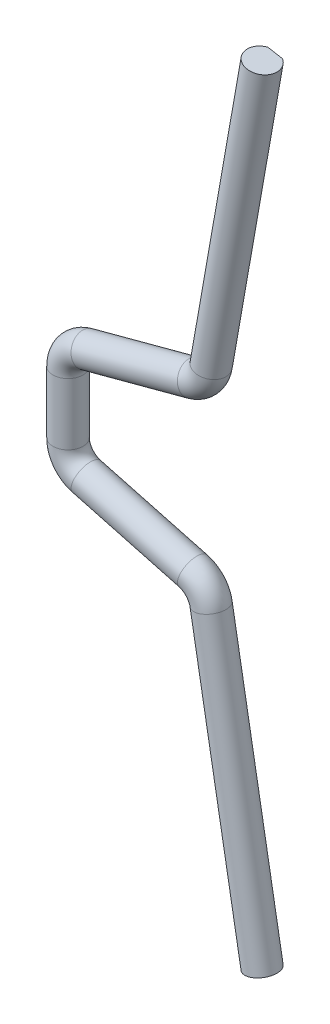
ISO-10303-21;
HEADER;
FILE_DESCRIPTION(('STEP AP214'),'2;1');
FILE_NAME('part.step','',(''),(''),'','','');
FILE_SCHEMA(('AUTOMOTIVE_DESIGN { 1 0 10303 214 1 1 1 1 }'));
ENDSEC;
DATA;
#1=APPLICATION_CONTEXT('core data for automotive mechanical design processes');
#2=APPLICATION_PROTOCOL_DEFINITION('international standard','automotive_design',2000,#1);
#3=PRODUCT_CONTEXT('',#1,'mechanical');
#4=PRODUCT('Part','Part','',(#3));
#5=PRODUCT_RELATED_PRODUCT_CATEGORY('part','',(#4));
#6=PRODUCT_DEFINITION_FORMATION('','',#4);
#7=PRODUCT_DEFINITION_CONTEXT('part definition',#1,'design');
#8=PRODUCT_DEFINITION('design','',#6,#7);
#9=PRODUCT_DEFINITION_SHAPE('','',#8);
#10=(LENGTH_UNIT() NAMED_UNIT(*) SI_UNIT(.MILLI.,.METRE.));
#11=(NAMED_UNIT(*) PLANE_ANGLE_UNIT() SI_UNIT($,.RADIAN.));
#12=(NAMED_UNIT(*) SI_UNIT($,.STERADIAN.) SOLID_ANGLE_UNIT());
#13=UNCERTAINTY_MEASURE_WITH_UNIT(LENGTH_MEASURE(1.E-05),#10,'distance_accuracy_value','');
#14=(GEOMETRIC_REPRESENTATION_CONTEXT(3) GLOBAL_UNCERTAINTY_ASSIGNED_CONTEXT((#13)) GLOBAL_UNIT_ASSIGNED_CONTEXT((#10,
#11,#12)) REPRESENTATION_CONTEXT('',''));
#15=CARTESIAN_POINT('',(0.,0.,0.));
#16=DIRECTION('',(0.,0.,1.));
#17=DIRECTION('',(1.,0.,0.));
#18=AXIS2_PLACEMENT_3D('',#15,#16,#17);
#19=CARTESIAN_POINT('',(0.,1.54084126502629,0.));
#20=DIRECTION('',(0.,-1.,0.));
#21=DIRECTION('',(1.,0.,0.));
#22=AXIS2_PLACEMENT_3D('',#19,#20,#21);
#23=CYLINDRICAL_SURFACE('',#22,0.75);
#24=CARTESIAN_POINT('',(0.,1.5408412650263,0.));
#25=DIRECTION('',(0.,1.,0.));
#26=DIRECTION('',(0.,0.,1.));
#27=AXIS2_PLACEMENT_3D('',#24,#25,#26);
#28=CIRCLE('',#27,0.75);
#29=CARTESIAN_POINT('',(-0.65,1.5408412650263,0.374165738677395));
#30=VERTEX_POINT('',#29);
#31=CARTESIAN_POINT('',(0.374165738677394,1.5408412650263,-0.65));
#32=VERTEX_POINT('',#31);
#33=EDGE_CURVE('E137',#30,#32,#28,.T.);
#34=ORIENTED_EDGE('',*,*,#33,.F.);
#35=DIRECTION('',(0.,-1.,0.));
#36=VECTOR('',#35,1.);
#37=CARTESIAN_POINT('',(-0.65,1.54084126502629,0.374165738677395));
#38=LINE('',#37,#36);
#39=CARTESIAN_POINT('',(-0.65,-1.54084126502631,0.374165738677396));
#40=VERTEX_POINT('',#39);
#41=EDGE_CURVE('E126',#30,#40,#38,.T.);
#42=ORIENTED_EDGE('',*,*,#41,.T.);
#43=CARTESIAN_POINT('',(0.,-1.54084126502629,0.));
#44=DIRECTION('',(0.,1.,0.));
#45=DIRECTION('',(0.,0.,1.));
#46=AXIS2_PLACEMENT_3D('',#43,#44,#45);
#47=CIRCLE('',#46,0.75);
#48=CARTESIAN_POINT('',(0.374165738677394,-1.54084126502629,-0.65));
#49=VERTEX_POINT('',#48);
#50=EDGE_CURVE('E135',#40,#49,#47,.T.);
#51=ORIENTED_EDGE('',*,*,#50,.T.);
#52=DIRECTION('',(0.,-1.,0.));
#53=VECTOR('',#52,1.);
#54=CARTESIAN_POINT('',(0.374165738677394,1.54084126502629,-0.65));
#55=LINE('',#54,#53);
#56=EDGE_CURVE('E224',#49,#32,#55,.F.);
#57=ORIENTED_EDGE('',*,*,#56,.T.);
#58=EDGE_LOOP('',(#34,#42,#51,#57));
#59=FACE_BOUND('',#58,.T.);
#60=ADVANCED_FACE('F34',(#59),#23,.T.);
#61=CARTESIAN_POINT('',(9.68358303061866,19.595,0.));
#62=DIRECTION('',(0.173648177666931,0.984807753012208,0.));
#63=DIRECTION('',(0.,0.,1.));
#64=AXIS2_PLACEMENT_3D('',#61,#62,#63);
#65=PLANE('',#64);
#66=DIRECTION('',(0.984807753012208,-0.173648177666931,0.));
#67=VECTOR('',#66,1.);
#68=CARTESIAN_POINT('',(9.68358303061866,19.595,-0.65));
#69=LINE('',#68,#67);
#70=CARTESIAN_POINT('',(9.31510171025762,19.6599731986667,-0.65));
#71=VERTEX_POINT('',#70);
#72=CARTESIAN_POINT('',(10.0520643509797,19.5300268013333,-0.65));
#73=VERTEX_POINT('',#72);
#74=EDGE_CURVE('E173',#71,#73,#69,.T.);
#75=ORIENTED_EDGE('',*,*,#74,.F.);
#76=CARTESIAN_POINT('',(9.68358303061866,19.595,0.));
#77=DIRECTION('',(0.173648177666931,0.984807753012208,0.));
#78=DIRECTION('',(0.,0.,1.));
#79=AXIS2_PLACEMENT_3D('',#76,#77,#78);
#80=CIRCLE('',#79,0.75);
#81=EDGE_CURVE('E205',#71,#73,#80,.T.);
#82=ORIENTED_EDGE('',*,*,#81,.T.);
#83=EDGE_LOOP('',(#75,#82));
#84=FACE_BOUND('',#83,.T.);
#85=ADVANCED_FACE('F36',(#84),#65,.T.);
#86=CARTESIAN_POINT('',(9.68358303061866,-19.595,0.));
#87=DIRECTION('',(-0.173648177666931,0.984807753012208,0.));
#88=DIRECTION('',(0.,0.,1.));
#89=AXIS2_PLACEMENT_3D('',#86,#87,#88);
#90=PLANE('',#89);
#91=CARTESIAN_POINT('',(9.68358303061866,-19.595,0.));
#92=DIRECTION('',(-0.173648177666931,0.984807753012208,0.));
#93=DIRECTION('',(0.,0.,1.));
#94=AXIS2_PLACEMENT_3D('',#91,#92,#93);
#95=CIRCLE('',#94,0.75);
#96=CARTESIAN_POINT('',(9.31510171025762,-19.6599731986667,-0.65));
#97=VERTEX_POINT('',#96);
#98=CARTESIAN_POINT('',(10.0520643509797,-19.5300268013333,-0.65));
#99=VERTEX_POINT('',#98);
#100=EDGE_CURVE('E159',#97,#99,#95,.T.);
#101=ORIENTED_EDGE('',*,*,#100,.F.);
#102=DIRECTION('',(0.984807753012208,0.173648177666931,0.));
#103=VECTOR('',#102,1.);
#104=CARTESIAN_POINT('',(9.68358303061866,-19.595,-0.65));
#105=LINE('',#104,#103);
#106=EDGE_CURVE('E172',#97,#99,#105,.T.);
#107=ORIENTED_EDGE('',*,*,#106,.T.);
#108=EDGE_LOOP('',(#101,#107));
#109=FACE_BOUND('',#108,.T.);
#110=ADVANCED_FACE('F171',(#109),#90,.F.);
#111=CARTESIAN_POINT('',(9.68358303061866,19.595,0.));
#112=DIRECTION('',(-0.173648177666931,-0.984807753012208,0.));
#113=DIRECTION('',(0.984807753012208,-0.173648177666931,0.));
#114=AXIS2_PLACEMENT_3D('',#111,#112,#113);
#115=CYLINDRICAL_SURFACE('',#114,0.75);
#116=ORIENTED_EDGE('',*,*,#81,.F.);
#117=DIRECTION('',(-0.173648177666931,-0.984807753012208,0.));
#118=VECTOR('',#117,1.);
#119=CARTESIAN_POINT('',(9.31510171025762,19.6599731986667,-0.65));
#120=LINE('',#119,#118);
#121=CARTESIAN_POINT('',(6.76980129193274,5.22485721075549,-0.65));
#122=VERTEX_POINT('',#121);
#123=EDGE_CURVE('E202',#71,#122,#120,.T.);
#124=ORIENTED_EDGE('',*,*,#123,.T.);
#125=CARTESIAN_POINT('',(7.13828261229377,5.15988401208876,0.));
#126=DIRECTION('',(0.173648177666931,0.984807753012208,0.));
#127=DIRECTION('',(0.,0.,1.));
#128=AXIS2_PLACEMENT_3D('',#125,#126,#127);
#129=CIRCLE('',#128,0.75);
#130=CARTESIAN_POINT('',(7.50676393265481,5.09491081342203,-0.65));
#131=VERTEX_POINT('',#130);
#132=EDGE_CURVE('E208',#122,#131,#129,.T.);
#133=ORIENTED_EDGE('',*,*,#132,.T.);
#134=DIRECTION('',(-0.173648177666931,-0.984807753012208,0.));
#135=VECTOR('',#134,1.);
#136=CARTESIAN_POINT('',(10.0520643509797,19.5300268013333,-0.65));
#137=LINE('',#136,#135);
#138=EDGE_CURVE('E174',#131,#73,#137,.F.);
#139=ORIENTED_EDGE('',*,*,#138,.T.);
#140=EDGE_LOOP('',(#116,#124,#133,#139));
#141=FACE_BOUND('',#140,.T.);
#142=ADVANCED_FACE('F239',(#141),#115,.T.);
#143=CARTESIAN_POINT('',(5.90727292102851,5.37694423417241,0.));
#144=DIRECTION('',(0.,0.,-1.));
#145=DIRECTION('',(-1.,0.,0.));
#146=AXIS2_PLACEMENT_3D('',#143,#144,#145);
#147=TOROIDAL_SURFACE('',#146,1.25,0.75);
#148=CARTESIAN_POINT('',(6.23079672740665,4.16953695131108,0.));
#149=DIRECTION('',(0.96592582628907,0.258819045102514,0.));
#150=DIRECTION('',(0.,0.,1.));
#151=AXIS2_PLACEMENT_3D('',#148,#149,#150);
#152=CIRCLE('',#151,0.75);
#153=CARTESIAN_POINT('',(6.13395550821209,4.5309533016121,-0.65));
#154=VERTEX_POINT('',#153);
#155=CARTESIAN_POINT('',(6.32763794660121,3.80812060101005,-0.65));
#156=VERTEX_POINT('',#155);
#157=EDGE_CURVE('E211',#154,#156,#152,.T.);
#158=ORIENTED_EDGE('',*,*,#157,.T.);
#159=CARTESIAN_POINT('',(5.90727292102851,5.37694423417241,-0.65));
#160=DIRECTION('',(0.,0.,1.));
#161=DIRECTION('',(1.,0.,0.));
#162=AXIS2_PLACEMENT_3D('',#159,#160,#161);
#163=CIRCLE('',#162,1.62416573867739);
#164=EDGE_CURVE('E179',#156,#131,#163,.T.);
#165=ORIENTED_EDGE('',*,*,#164,.T.);
#166=ORIENTED_EDGE('',*,*,#132,.F.);
#167=CARTESIAN_POINT('',(5.90727292102851,5.37694423417241,-0.65));
#168=DIRECTION('',(0.,0.,-1.));
#169=DIRECTION('',(-1.,0.,0.));
#170=AXIS2_PLACEMENT_3D('',#167,#168,#169);
#171=CIRCLE('',#170,0.875834261322606);
#172=EDGE_CURVE('E199',#122,#154,#171,.T.);
#173=ORIENTED_EDGE('',*,*,#172,.T.);
#174=EDGE_LOOP('',(#158,#165,#166,#173));
#175=FACE_BOUND('',#174,.T.);
#176=ADVANCED_FACE('F235',(#175),#147,.T.);
#177=CARTESIAN_POINT('',(6.23079672740665,4.16953695131108,0.));
#178=DIRECTION('',(-0.965925826289069,-0.258819045102518,0.));
#179=DIRECTION('',(0.258819045102518,-0.965925826289069,0.));
#180=AXIS2_PLACEMENT_3D('',#177,#178,#179);
#181=CYLINDRICAL_SURFACE('',#180,0.75);
#182=ORIENTED_EDGE('',*,*,#157,.F.);
#183=DIRECTION('',(-0.965925826289069,-0.258819045102518,0.));
#184=VECTOR('',#183,1.);
#185=CARTESIAN_POINT('',(6.13395550821209,4.5309533016121,-0.65));
#186=LINE('',#185,#184);
#187=CARTESIAN_POINT('',(0.829634974427297,3.10966489818866,-0.65));
#188=VERTEX_POINT('',#187);
#189=EDGE_CURVE('E196',#154,#188,#186,.T.);
#190=ORIENTED_EDGE('',*,*,#189,.T.);
#191=CARTESIAN_POINT('',(0.926476193621859,2.74824854788763,0.));
#192=DIRECTION('',(0.965925826289069,0.258819045102518,0.));
#193=DIRECTION('',(0.,0.,1.));
#194=AXIS2_PLACEMENT_3D('',#191,#192,#193);
#195=CIRCLE('',#194,0.75);
#196=CARTESIAN_POINT('',(1.02331741281642,2.38683219758661,-0.65));
#197=VERTEX_POINT('',#196);
#198=EDGE_CURVE('E213',#188,#197,#195,.T.);
#199=ORIENTED_EDGE('',*,*,#198,.T.);
#200=DIRECTION('',(-0.965925826289069,-0.258819045102518,0.));
#201=VECTOR('',#200,1.);
#202=CARTESIAN_POINT('',(6.32763794660122,3.80812060101006,-0.65));
#203=LINE('',#202,#201);
#204=EDGE_CURVE('E225',#197,#156,#203,.F.);
#205=ORIENTED_EDGE('',*,*,#204,.T.);
#206=EDGE_LOOP('',(#182,#190,#199,#205));
#207=FACE_BOUND('',#206,.T.);
#208=ADVANCED_FACE('F263',(#207),#181,.T.);
#209=CARTESIAN_POINT('',(1.25,1.5408412650263,0.));
#210=DIRECTION('',(0.,0.,1.));
#211=DIRECTION('',(1.,0.,0.));
#212=AXIS2_PLACEMENT_3D('',#209,#210,#211);
#213=TOROIDAL_SURFACE('',#212,1.25,0.75);
#214=CARTESIAN_POINT('',(-0.374165738677395,1.5408412650263,-0.65));
#215=VERTEX_POINT('',#214);
#216=CARTESIAN_POINT('',(-0.65,1.5408412650263,-0.374165738677395));
#217=VERTEX_POINT('',#216);
#218=EDGE_CURVE('E145',#215,#217,#28,.T.);
#219=ORIENTED_EDGE('',*,*,#218,.T.);
#220=CARTESIAN_POINT('',(-0.65,2.1651752605692,0.00881172960901489));
#221=CARTESIAN_POINT('',(-0.65,2.16463028435273,0.0232484352988237));
#222=CARTESIAN_POINT('',(-0.65,2.1627418300577,0.0376447631296973));
#223=CARTESIAN_POINT('',(-0.65,2.15643836718233,0.0658773774814485));
#224=CARTESIAN_POINT('',(-0.65,2.1520198236244,0.0797128513698085));
#225=CARTESIAN_POINT('',(-0.65,2.14103961890119,0.106374036080687));
#226=CARTESIAN_POINT('',(-0.65,2.13449376839444,0.119206355412493));
#227=CARTESIAN_POINT('',(-0.65,2.11964308651161,0.14379386604838));
#228=CARTESIAN_POINT('',(-0.65,2.11133782311879,0.155548791785329));
#229=CARTESIAN_POINT('',(-0.65,2.08811342394886,0.184413793818289));
#230=CARTESIAN_POINT('',(-0.65,2.07214936860865,0.200683088252763));
#231=CARTESIAN_POINT('',(-0.65,2.0378720387074,0.230523493750472));
#232=CARTESIAN_POINT('',(-0.65,2.01955241373653,0.244087048477159));
#233=CARTESIAN_POINT('',(-0.65,1.97032907421194,0.275900775574815));
#234=CARTESIAN_POINT('',(-0.65,1.93826182970121,0.292341533697338));
#235=CARTESIAN_POINT('',(-0.65,1.87204859934133,0.320213877091844));
#236=CARTESIAN_POINT('',(-0.65,1.83789811439183,0.331634149813663));
#237=CARTESIAN_POINT('',(-0.65,1.74887921146707,0.355502013466395));
#238=CARTESIAN_POINT('',(-0.65,1.69319245611496,0.364893975889989));
#239=CARTESIAN_POINT('',(-0.65,1.58101437530103,0.374906016838325));
#240=CARTESIAN_POINT('',(-0.65,1.52452176179885,0.375509979595203));
#241=CARTESIAN_POINT('',(-0.65,1.41981717916313,0.368508679690624));
#242=CARTESIAN_POINT('',(-0.65,1.37153022683237,0.362015800258232));
#243=CARTESIAN_POINT('',(-0.65,1.27655878729941,0.341747707607204));
#244=CARTESIAN_POINT('',(-0.65,1.22986902926464,0.327999544161018));
#245=CARTESIAN_POINT('',(-0.65,1.16109547297792,0.300073318241164));
#246=CARTESIAN_POINT('',(-0.65,1.13770878126427,0.289098228141343));
#247=CARTESIAN_POINT('',(-0.65,1.09252368932692,0.264204782377273));
#248=CARTESIAN_POINT('',(-0.65,1.07072437573704,0.250288137545249));
#249=CARTESIAN_POINT('',(-0.65,1.0338697978946,0.222318642395732));
#250=CARTESIAN_POINT('',(-0.65,1.01834997245561,0.208883464415121));
#251=CARTESIAN_POINT('',(-0.65,0.989604427214329,0.179737197660591));
#252=CARTESIAN_POINT('',(-0.65,0.976374558432947,0.164030321644153));
#253=CARTESIAN_POINT('',(-0.65,0.956204134980522,0.134790648665732));
#254=CARTESIAN_POINT('',(-0.65,0.94852437173067,0.121770525193747));
#255=CARTESIAN_POINT('',(-0.65,0.935373624492995,0.0946506502579102));
#256=CARTESIAN_POINT('',(-0.65,0.929900950035586,0.0805517349556614));
#257=CARTESIAN_POINT('',(-0.65,0.921552136665207,0.0514696587825298));
#258=CARTESIAN_POINT('',(-0.65,0.918696879138042,0.0364803855791782));
#259=CARTESIAN_POINT('',(-0.65,0.915935441418928,0.00623301766086297));
#260=CARTESIAN_POINT('',(-0.65,0.916027656140813,-0.00902492622126949));
#261=CARTESIAN_POINT('',(-0.65,0.918959053282477,-0.0374381536283524));
#262=CARTESIAN_POINT('',(-0.65,0.921472073321844,-0.0506287000204518));
#263=CARTESIAN_POINT('',(-0.65,0.928585040783578,-0.076429944110019));
#264=CARTESIAN_POINT('',(-0.65,0.933185729402291,-0.089040434114103));
#265=CARTESIAN_POINT('',(-0.65,0.945786895305142,-0.116983002340174));
#266=CARTESIAN_POINT('',(-0.65,0.954386333223314,-0.132044176446906));
#267=CARTESIAN_POINT('',(-0.65,0.973913881814151,-0.160568091019024));
#268=CARTESIAN_POINT('',(-0.65,0.984846214608691,-0.174027863506514));
#269=CARTESIAN_POINT('',(-0.65,1.01363749770502,-0.204877511223195));
#270=CARTESIAN_POINT('',(-0.65,1.03242839965613,-0.221392993988945));
#271=CARTESIAN_POINT('',(-0.65,1.07232081778274,-0.251311453250494));
#272=CARTESIAN_POINT('',(-0.65,1.09342683852207,-0.264708197666858));
#273=CARTESIAN_POINT('',(-0.65,1.15040714611853,-0.296084548602564));
#274=CARTESIAN_POINT('',(-0.65,1.18746437278325,-0.31190465829166));
#275=CARTESIAN_POINT('',(-0.65,1.26352185434299,-0.33781857584921));
#276=CARTESIAN_POINT('',(-0.65,1.3025271978754,-0.347896431300344));
#277=CARTESIAN_POINT('',(-0.65,1.40030037489033,-0.366809744086869));
#278=CARTESIAN_POINT('',(-0.65,1.45962668633922,-0.372763692389037));
#279=CARTESIAN_POINT('',(-0.65,1.57845412387212,-0.375133077933442));
#280=CARTESIAN_POINT('',(-0.65,1.6379552616649,-0.371547861053837));
#281=CARTESIAN_POINT('',(-0.65,1.73695597075967,-0.356895844376167));
#282=CARTESIAN_POINT('',(-0.65,1.77686051524007,-0.34853675515681));
#283=CARTESIAN_POINT('',(-0.65,1.85508293717433,-0.326282849386733));
#284=CARTESIAN_POINT('',(-0.65,1.89340471530283,-0.312402664841658));
#285=CARTESIAN_POINT('',(-0.65,1.95302119577848,-0.284442857543301));
#286=CARTESIAN_POINT('',(-0.65,1.97527805442925,-0.272420543961385));
#287=CARTESIAN_POINT('',(-0.65,2.01791798759228,-0.245377677323746));
#288=CARTESIAN_POINT('',(-0.65,2.03830321590511,-0.230360635277455));
#289=CARTESIAN_POINT('',(-0.65,2.07111892833499,-0.201401793626171));
#290=CARTESIAN_POINT('',(-0.65,2.08422529744689,-0.188231001157161));
#291=CARTESIAN_POINT('',(-0.65,2.10823517593772,-0.160000189584218));
#292=CARTESIAN_POINT('',(-0.65,2.11914173074271,-0.144942829752494));
#293=CARTESIAN_POINT('',(-0.65,2.1359691184137,-0.116464523376952));
#294=CARTESIAN_POINT('',(-0.65,2.14245724910321,-0.103380427037781));
#295=CARTESIAN_POINT('',(-0.65,2.15318104357262,-0.0763244319403349));
#296=CARTESIAN_POINT('',(-0.65,2.15742088330702,-0.0623542334640281));
#297=CARTESIAN_POINT('',(-0.65,2.16231330816926,-0.0387753122249242));
#298=CARTESIAN_POINT('',(-0.65,2.1636975197236,-0.0293142678293341));
#299=CARTESIAN_POINT('',(-0.65,2.16530869855392,-0.0102923665281807));
#300=CARTESIAN_POINT('',(-0.65,2.16553551112376,-0.000731496450351349));
#301=CARTESIAN_POINT('',(-0.65,2.1651752605692,0.00881172960901489));
#302=B_SPLINE_CURVE_WITH_KNOTS('',3,(#220,#221,#222,#223,#224,#225,#226,#227,#228,#229,#230,
#231,#232,#233,#234,#235,#236,#237,#238,#239,#240,#241,#242,#243,#244,#245,#246,#247,#248,#249,
#250,#251,#252,#253,#254,#255,#256,#257,#258,#259,#260,#261,#262,#263,#264,#265,#266,#267,#268,
#269,#270,#271,#272,#273,#274,#275,#276,#277,#278,#279,#280,#281,#282,#283,#284,#285,#286,#287,
#288,#289,#290,#291,#292,#293,#294,#295,#296,#297,#298,#299,#300,#301),.UNSPECIFIED.,.T.,.F.,(4,
2,2,2,2,2,2,2,2,2,2,2,2,2,2,2,2,2,2,2,2,2,2,2,2,2,2,2,2,2,2,2,2,2,2,2,2,2,2,2,4),(0.,
0.0433008868003196,0.0866624206543119,0.129708781755022,0.172765724992796,0.240756188943466,
0.308933950940842,0.416437171803682,0.524181401015611,0.692714211145828,0.86155604427936,
1.00728637949054,1.1524771894084,1.22982138496193,1.30712071967379,1.3685089426655,
1.42978475002403,1.47496489203777,1.52011036332434,1.56561294159519,1.61109074123958,
1.65119006826897,1.69130364313323,1.74304685656016,1.79488452242478,1.86951651368043,
1.94429638359619,2.06450140046087,2.18503874790044,2.36302665964307,2.5410267767285,
2.66304333320332,2.784738653223,2.86044833562795,2.93606977263575,2.99163643477031,
3.04712563419879,3.09076932403232,3.1343316640029,3.16295141519462,3.1915749918045),.UNSPECIFIED.);
#303=EDGE_CURVE('E138',#217,#30,#302,.T.);
#304=ORIENTED_EDGE('',*,*,#303,.T.);
#305=ORIENTED_EDGE('',*,*,#33,.T.);
#306=CARTESIAN_POINT('',(1.25,1.5408412650263,-0.65));
#307=DIRECTION('',(0.,0.,-1.));
#308=DIRECTION('',(-1.,0.,0.));
#309=AXIS2_PLACEMENT_3D('',#306,#307,#308);
#310=CIRCLE('',#309,0.875834261322605);
#311=EDGE_CURVE('E222',#32,#197,#310,.T.);
#312=ORIENTED_EDGE('',*,*,#311,.T.);
#313=ORIENTED_EDGE('',*,*,#198,.F.);
#314=CARTESIAN_POINT('',(1.25,1.5408412650263,-0.65));
#315=DIRECTION('',(0.,0.,1.));
#316=DIRECTION('',(1.,0.,0.));
#317=AXIS2_PLACEMENT_3D('',#314,#315,#316);
#318=CIRCLE('',#317,1.62416573867739);
#319=EDGE_CURVE('E193',#188,#215,#318,.T.);
#320=ORIENTED_EDGE('',*,*,#319,.T.);
#321=EDGE_LOOP('',(#219,#304,#305,#312,#313,#320));
#322=FACE_BOUND('',#321,.T.);
#323=ADVANCED_FACE('F221',(#322),#213,.T.);
#324=CARTESIAN_POINT('',(-0.374165738677394,-1.54084126502629,-0.65));
#325=VERTEX_POINT('',#324);
#326=CARTESIAN_POINT('',(-0.65,-1.54084126502629,-0.374165738677394));
#327=VERTEX_POINT('',#326);
#328=EDGE_CURVE('E144',#325,#327,#47,.T.);
#329=ORIENTED_EDGE('',*,*,#328,.T.);
#330=DIRECTION('',(0.,-1.,0.));
#331=VECTOR('',#330,1.);
#332=CARTESIAN_POINT('',(-0.65,1.54084126502629,-0.374165738677395));
#333=LINE('',#332,#331);
#334=EDGE_CURVE('E54',#327,#217,#333,.F.);
#335=ORIENTED_EDGE('',*,*,#334,.T.);
#336=ORIENTED_EDGE('',*,*,#218,.F.);
#337=DIRECTION('',(0.,-1.,0.));
#338=VECTOR('',#337,1.);
#339=CARTESIAN_POINT('',(-0.374165738677395,1.54084126502629,-0.65));
#340=LINE('',#339,#338);
#341=EDGE_CURVE('E190',#215,#325,#340,.T.);
#342=ORIENTED_EDGE('',*,*,#341,.T.);
#343=EDGE_LOOP('',(#329,#335,#336,#342));
#344=FACE_BOUND('',#343,.T.);
#345=ADVANCED_FACE('F248',(#344),#23,.T.);
#346=CARTESIAN_POINT('',(1.25,-1.5408412650263,0.));
#347=DIRECTION('',(0.,0.,1.));
#348=DIRECTION('',(1.,0.,0.));
#349=AXIS2_PLACEMENT_3D('',#346,#347,#348);
#350=TOROIDAL_SURFACE('',#349,1.25,0.75);
#351=ORIENTED_EDGE('',*,*,#50,.F.);
#352=CARTESIAN_POINT('',(-0.65,-2.1651752605692,0.00881172960901489));
#353=CARTESIAN_POINT('',(-0.65,-2.16574469127728,-0.00636748005990547));
#354=CARTESIAN_POINT('',(-0.65,-2.16482705266465,-0.021631283210373));
#355=CARTESIAN_POINT('',(-0.65,-2.1600959242201,-0.0517202016898285));
#356=CARTESIAN_POINT('',(-0.65,-2.15627473838754,-0.0665440421933047));
#357=CARTESIAN_POINT('',(-0.65,-2.14612411894135,-0.0951551453895491));
#358=CARTESIAN_POINT('',(-0.65,-2.13981555243033,-0.10894992438839));
#359=CARTESIAN_POINT('',(-0.65,-2.12514276970646,-0.135377905051398));
#360=CARTESIAN_POINT('',(-0.65,-2.1167782295038,-0.148010923208363));
#361=CARTESIAN_POINT('',(-0.65,-2.09426916822572,-0.177473024367432));
#362=CARTESIAN_POINT('',(-0.65,-2.07922270723487,-0.193610868552127));
#363=CARTESIAN_POINT('',(-0.65,-2.04678630564049,-0.223323923003815));
#364=CARTESIAN_POINT('',(-0.65,-2.02939066540134,-0.236892701572038));
#365=CARTESIAN_POINT('',(-0.65,-1.98270071046558,-0.268732670621259));
#366=CARTESIAN_POINT('',(-0.65,-1.95225423861428,-0.285305344300582));
#367=CARTESIAN_POINT('',(-0.65,-1.88924727005308,-0.313670268403201));
#368=CARTESIAN_POINT('',(-0.65,-1.85668266483906,-0.325452886239025));
#369=CARTESIAN_POINT('',(-0.65,-1.77102495888052,-0.350692928841752));
#370=CARTESIAN_POINT('',(-0.65,-1.71703945432912,-0.361116896579343));
#371=CARTESIAN_POINT('',(-0.65,-1.60801565776378,-0.373523932786457));
#372=CARTESIAN_POINT('',(-0.65,-1.5529743534026,-0.375477470086646));
#373=CARTESIAN_POINT('',(-0.65,-1.44112459032171,-0.371099202109704));
#374=CARTESIAN_POINT('',(-0.65,-1.38432817951527,-0.364450712434335));
#375=CARTESIAN_POINT('',(-0.65,-1.27291947293193,-0.34124335330942));
#376=CARTESIAN_POINT('',(-0.65,-1.21829552097857,-0.324748211572568));
#377=CARTESIAN_POINT('',(-0.65,-1.14499774717351,-0.292506263619867));
#378=CARTESIAN_POINT('',(-0.65,-1.12401626685715,-0.281986272456297));
#379=CARTESIAN_POINT('',(-0.65,-1.08344214716625,-0.258437050568795));
#380=CARTESIAN_POINT('',(-0.65,-1.06385129305988,-0.245404671428878));
#381=CARTESIAN_POINT('',(-0.65,-1.02655950453078,-0.21633341852476));
#382=CARTESIAN_POINT('',(-0.65,-1.00888846675608,-0.200255444640287));
#383=CARTESIAN_POINT('',(-0.65,-0.976967197476438,-0.165000963820066));
#384=CARTESIAN_POINT('',(-0.65,-0.962703265920107,-0.145837403330881));
#385=CARTESIAN_POINT('',(-0.65,-0.943849679581571,-0.112836437451518));
#386=CARTESIAN_POINT('',(-0.65,-0.937667769954268,-0.0999067466837249));
#387=CARTESIAN_POINT('',(-0.65,-0.92749630857173,-0.0732067591734802));
#388=CARTESIAN_POINT('',(-0.65,-0.923504923535509,-0.0594371761070979));
#389=CARTESIAN_POINT('',(-0.65,-0.918007841906885,-0.0313229018834478));
#390=CARTESIAN_POINT('',(-0.65,-0.916516037630147,-0.0169754473882616));
#391=CARTESIAN_POINT('',(-0.65,-0.916196044583302,0.0117493963687772));
#392=CARTESIAN_POINT('',(-0.65,-0.917367599831763,0.0261267826211298));
#393=CARTESIAN_POINT('',(-0.65,-0.922077518768345,0.0533445054482269));
#394=CARTESIAN_POINT('',(-0.65,-0.925427905516421,0.066218270676352));
#395=CARTESIAN_POINT('',(-0.65,-0.934072641238527,0.0912895757839928));
#396=CARTESIAN_POINT('',(-0.65,-0.939367734846408,0.103486854573037));
#397=CARTESIAN_POINT('',(-0.65,-0.953880682326276,0.131388658761958));
#398=CARTESIAN_POINT('',(-0.65,-0.963825057474421,0.146714874748293));
#399=CARTESIAN_POINT('',(-0.65,-0.986051263064651,0.175563842374628));
#400=CARTESIAN_POINT('',(-0.65,-0.998337974651178,0.189082725852579));
#401=CARTESIAN_POINT('',(-0.65,-1.03082851591236,0.220312977623591));
#402=CARTESIAN_POINT('',(-0.65,-1.05202824682917,0.236982820506095));
#403=CARTESIAN_POINT('',(-0.65,-1.09671270247416,0.266862739204936));
#404=CARTESIAN_POINT('',(-0.65,-1.12020181032484,0.280065992289358));
#405=CARTESIAN_POINT('',(-0.65,-1.18362960268128,0.310751112924712));
#406=CARTESIAN_POINT('',(-0.65,-1.22473558840208,0.325808270321539));
#407=CARTESIAN_POINT('',(-0.65,-1.30874661580972,0.349596173428663));
#408=CARTESIAN_POINT('',(-0.65,-1.35165670834797,0.358307706644156));
#409=CARTESIAN_POINT('',(-0.65,-1.45462379559379,0.372505595125176));
#410=CARTESIAN_POINT('',(-0.65,-1.51502298645966,0.375522860209077));
#411=CARTESIAN_POINT('',(-0.65,-1.63546567681692,0.371725506104827));
#412=CARTESIAN_POINT('',(-0.65,-1.69550956485342,0.364925124944325));
#413=CARTESIAN_POINT('',(-0.65,-1.7889144564119,0.345323768920382));
#414=CARTESIAN_POINT('',(-0.65,-1.82304727306432,0.336164313961423));
#415=CARTESIAN_POINT('',(-0.65,-1.88980732336986,0.313396741197732));
#416=CARTESIAN_POINT('',(-0.65,-1.92243699149514,0.299796127601105));
#417=CARTESIAN_POINT('',(-0.65,-1.97564354730391,0.272127006336806));
#418=CARTESIAN_POINT('',(-0.65,-1.99691593068373,0.259404081704792));
#419=CARTESIAN_POINT('',(-0.65,-2.03737444874437,0.230959637879055));
#420=CARTESIAN_POINT('',(-0.65,-2.05656395479107,0.215243081354088));
#421=CARTESIAN_POINT('',(-0.65,-2.08649462409483,0.185672038380786));
#422=CARTESIAN_POINT('',(-0.65,-2.09805299177955,0.172648998042665));
#423=CARTESIAN_POINT('',(-0.65,-2.11900999933995,0.144949561728869));
#424=CARTESIAN_POINT('',(-0.65,-2.12841082084102,0.13027485843407));
#425=CARTESIAN_POINT('',(-0.65,-2.14291192191296,0.102290992284423));
#426=CARTESIAN_POINT('',(-0.65,-2.14848533192377,0.0892279010972026));
#427=CARTESIAN_POINT('',(-0.65,-2.15737709688232,0.0623701990537154));
#428=CARTESIAN_POINT('',(-0.65,-2.1607016897036,0.0485777270798391));
#429=CARTESIAN_POINT('',(-0.65,-2.16341166621841,0.0303427076237023));
#430=CARTESIAN_POINT('',(-0.65,-2.16392980114201,0.0260515971214386));
#431=CARTESIAN_POINT('',(-0.65,-2.16473058485473,0.0174465230126728));
#432=CARTESIAN_POINT('',(-0.65,-2.16501316979651,0.0131325535287707));
#433=CARTESIAN_POINT('',(-0.65,-2.1651752605692,0.00881172960901489));
#434=B_SPLINE_CURVE_WITH_KNOTS('',3,(#352,#353,#354,#355,#356,#357,#358,#359,#360,#361,#362,
#363,#364,#365,#366,#367,#368,#369,#370,#371,#372,#373,#374,#375,#376,#377,#378,#379,#380,#381,
#382,#383,#384,#385,#386,#387,#388,#389,#390,#391,#392,#393,#394,#395,#396,#397,#398,#399,#400,
#401,#402,#403,#404,#405,#406,#407,#408,#409,#410,#411,#412,#413,#414,#415,#416,#417,#418,#419,
#420,#421,#422,#423,#424,#425,#426,#427,#428,#429,#430,#431,#432,#433),.UNSPECIFIED.,.T.,.F.,(4,
2,2,2,2,2,2,2,2,2,2,2,2,2,2,2,2,2,2,2,2,2,2,2,2,2,2,2,2,2,2,2,2,2,2,2,2,2,2,2,4),(0.,
0.0455482187313671,0.0912175883074591,0.136511713498804,0.181812980928414,0.247633517503901,
0.313616718925391,0.417028269919725,0.520646760304774,0.684718508549347,0.849361816228518,
1.02024244692902,1.19002894649988,1.26031165931869,1.33068302674796,1.40202797562712,
1.47308102443784,1.51591273639445,1.55870854700836,1.60174143118354,1.64477017954694,
1.68450621702466,1.72425748543534,1.77876115071717,1.83337966171989,1.9138327566782,
1.99444302730517,2.12504579840399,2.25604236719473,2.43662549237374,2.61694699006261,
2.7227438692936,2.82836290105541,2.90252764908654,2.97657050460278,3.02864107731444,
3.08065876404142,3.123098697024,3.16542042002695,3.17838239390857,3.19134788007612),.UNSPECIFIED.);
#435=EDGE_CURVE('E11',#40,#327,#434,.T.);
#436=ORIENTED_EDGE('',*,*,#435,.T.);
#437=ORIENTED_EDGE('',*,*,#328,.F.);
#438=CARTESIAN_POINT('',(1.25,-1.5408412650263,-0.65));
#439=DIRECTION('',(0.,0.,1.));
#440=DIRECTION('',(1.,0.,0.));
#441=AXIS2_PLACEMENT_3D('',#438,#439,#440);
#442=CIRCLE('',#441,1.62416573867739);
#443=CARTESIAN_POINT('',(0.8296349744273,-3.10966489818866,-0.65));
#444=VERTEX_POINT('',#443);
#445=EDGE_CURVE('E187',#325,#444,#442,.T.);
#446=ORIENTED_EDGE('',*,*,#445,.T.);
#447=CARTESIAN_POINT('',(0.926476193621859,-2.74824854788764,0.));
#448=DIRECTION('',(-0.96592582628907,0.258819045102513,0.));
#449=DIRECTION('',(0.,0.,1.));
#450=AXIS2_PLACEMENT_3D('',#447,#448,#449);
#451=CIRCLE('',#450,0.75);
#452=CARTESIAN_POINT('',(1.02331741281642,-2.38683219758661,-0.65));
#453=VERTEX_POINT('',#452);
#454=EDGE_CURVE('E147',#444,#453,#451,.T.);
#455=ORIENTED_EDGE('',*,*,#454,.T.);
#456=CARTESIAN_POINT('',(1.25,-1.5408412650263,-0.65));
#457=DIRECTION('',(0.,0.,-1.));
#458=DIRECTION('',(-1.,0.,0.));
#459=AXIS2_PLACEMENT_3D('',#456,#457,#458);
#460=CIRCLE('',#459,0.875834261322606);
#461=EDGE_CURVE('E143',#453,#49,#460,.T.);
#462=ORIENTED_EDGE('',*,*,#461,.T.);
#463=EDGE_LOOP('',(#351,#436,#437,#446,#455,#462));
#464=FACE_BOUND('',#463,.T.);
#465=ADVANCED_FACE('F141',(#464),#350,.T.);
#466=CARTESIAN_POINT('',(0.926476193621859,-2.74824854788764,0.));
#467=DIRECTION('',(0.965925826289069,-0.258819045102518,0.));
#468=DIRECTION('',(0.258819045102518,0.965925826289069,0.));
#469=AXIS2_PLACEMENT_3D('',#466,#467,#468);
#470=CYLINDRICAL_SURFACE('',#469,0.75);
#471=ORIENTED_EDGE('',*,*,#454,.F.);
#472=DIRECTION('',(0.965925826289069,-0.258819045102518,0.));
#473=VECTOR('',#472,1.);
#474=CARTESIAN_POINT('',(0.829634974427297,-3.10966489818866,-0.65));
#475=LINE('',#474,#473);
#476=CARTESIAN_POINT('',(6.13395550821209,-4.5309533016121,-0.65));
#477=VERTEX_POINT('',#476);
#478=EDGE_CURVE('E184',#444,#477,#475,.T.);
#479=ORIENTED_EDGE('',*,*,#478,.T.);
#480=CARTESIAN_POINT('',(6.23079672740665,-4.16953695131108,0.));
#481=DIRECTION('',(-0.965925826289069,0.258819045102518,0.));
#482=DIRECTION('',(0.,0.,1.));
#483=AXIS2_PLACEMENT_3D('',#480,#481,#482);
#484=CIRCLE('',#483,0.75);
#485=CARTESIAN_POINT('',(6.32763794660122,-3.80812060101005,-0.65));
#486=VERTEX_POINT('',#485);
#487=EDGE_CURVE('E153',#477,#486,#484,.T.);
#488=ORIENTED_EDGE('',*,*,#487,.T.);
#489=DIRECTION('',(0.965925826289069,-0.258819045102518,0.));
#490=VECTOR('',#489,1.);
#491=CARTESIAN_POINT('',(1.02331741281642,-2.38683219758661,-0.65));
#492=LINE('',#491,#490);
#493=EDGE_CURVE('E228',#486,#453,#492,.F.);
#494=ORIENTED_EDGE('',*,*,#493,.T.);
#495=EDGE_LOOP('',(#471,#479,#488,#494));
#496=FACE_BOUND('',#495,.T.);
#497=ADVANCED_FACE('F277',(#496),#470,.T.);
#498=CARTESIAN_POINT('',(5.90727292102851,-5.37694423417241,0.));
#499=DIRECTION('',(0.,0.,-1.));
#500=DIRECTION('',(-1.,0.,0.));
#501=AXIS2_PLACEMENT_3D('',#498,#499,#500);
#502=TOROIDAL_SURFACE('',#501,1.25,0.75);
#503=CARTESIAN_POINT('',(7.13828261229377,-5.15988401208876,0.));
#504=DIRECTION('',(-0.173648177666926,0.984807753012209,0.));
#505=DIRECTION('',(0.,0.,1.));
#506=AXIS2_PLACEMENT_3D('',#503,#504,#505);
#507=CIRCLE('',#506,0.75);
#508=CARTESIAN_POINT('',(6.76980129193274,-5.22485721075549,-0.65));
#509=VERTEX_POINT('',#508);
#510=CARTESIAN_POINT('',(7.50676393265481,-5.09491081342203,-0.65));
#511=VERTEX_POINT('',#510);
#512=EDGE_CURVE('E156',#509,#511,#507,.T.);
#513=ORIENTED_EDGE('',*,*,#512,.T.);
#514=CARTESIAN_POINT('',(5.90727292102851,-5.37694423417241,-0.65));
#515=DIRECTION('',(0.,0.,1.));
#516=DIRECTION('',(1.,0.,0.));
#517=AXIS2_PLACEMENT_3D('',#514,#515,#516);
#518=CIRCLE('',#517,1.62416573867739);
#519=EDGE_CURVE('E61',#511,#486,#518,.T.);
#520=ORIENTED_EDGE('',*,*,#519,.T.);
#521=ORIENTED_EDGE('',*,*,#487,.F.);
#522=CARTESIAN_POINT('',(5.90727292102851,-5.37694423417241,-0.65));
#523=DIRECTION('',(0.,0.,-1.));
#524=DIRECTION('',(-1.,0.,0.));
#525=AXIS2_PLACEMENT_3D('',#522,#523,#524);
#526=CIRCLE('',#525,0.875834261322605);
#527=EDGE_CURVE('E176',#477,#509,#526,.T.);
#528=ORIENTED_EDGE('',*,*,#527,.T.);
#529=EDGE_LOOP('',(#513,#520,#521,#528));
#530=FACE_BOUND('',#529,.T.);
#531=ADVANCED_FACE('F255',(#530),#502,.T.);
#532=CARTESIAN_POINT('',(7.13828261229377,-5.15988401208876,0.));
#533=DIRECTION('',(0.173648177666931,-0.984807753012208,0.));
#534=DIRECTION('',(0.984807753012208,0.173648177666931,0.));
#535=AXIS2_PLACEMENT_3D('',#532,#533,#534);
#536=CYLINDRICAL_SURFACE('',#535,0.75);
#537=ORIENTED_EDGE('',*,*,#512,.F.);
#538=DIRECTION('',(0.173648177666931,-0.984807753012208,0.));
#539=VECTOR('',#538,1.);
#540=CARTESIAN_POINT('',(6.76980129193274,-5.22485721075549,-0.65));
#541=LINE('',#540,#539);
#542=EDGE_CURVE('E47',#509,#97,#541,.T.);
#543=ORIENTED_EDGE('',*,*,#542,.T.);
#544=ORIENTED_EDGE('',*,*,#100,.T.);
#545=DIRECTION('',(0.173648177666931,-0.984807753012208,0.));
#546=VECTOR('',#545,1.);
#547=CARTESIAN_POINT('',(7.50676393265481,-5.09491081342203,-0.65));
#548=LINE('',#547,#546);
#549=EDGE_CURVE('E162',#99,#511,#548,.F.);
#550=ORIENTED_EDGE('',*,*,#549,.T.);
#551=EDGE_LOOP('',(#537,#543,#544,#550));
#552=FACE_BOUND('',#551,.T.);
#553=ADVANCED_FACE('F167',(#552),#536,.T.);
#554=CARTESIAN_POINT('',(-1.,-19.7252361332502,-0.65));
#555=DIRECTION('',(0.,0.,1.));
#556=DIRECTION('',(1.,0.,0.));
#557=AXIS2_PLACEMENT_3D('',#554,#555,#556);
#558=PLANE('',#557);
#559=ORIENTED_EDGE('',*,*,#74,.T.);
#560=ORIENTED_EDGE('',*,*,#138,.F.);
#561=ORIENTED_EDGE('',*,*,#164,.F.);
#562=ORIENTED_EDGE('',*,*,#204,.F.);
#563=ORIENTED_EDGE('',*,*,#311,.F.);
#564=ORIENTED_EDGE('',*,*,#56,.F.);
#565=ORIENTED_EDGE('',*,*,#461,.F.);
#566=ORIENTED_EDGE('',*,*,#493,.F.);
#567=ORIENTED_EDGE('',*,*,#519,.F.);
#568=ORIENTED_EDGE('',*,*,#549,.F.);
#569=ORIENTED_EDGE('',*,*,#106,.F.);
#570=ORIENTED_EDGE('',*,*,#542,.F.);
#571=ORIENTED_EDGE('',*,*,#527,.F.);
#572=ORIENTED_EDGE('',*,*,#478,.F.);
#573=ORIENTED_EDGE('',*,*,#445,.F.);
#574=ORIENTED_EDGE('',*,*,#341,.F.);
#575=ORIENTED_EDGE('',*,*,#319,.F.);
#576=ORIENTED_EDGE('',*,*,#189,.F.);
#577=ORIENTED_EDGE('',*,*,#172,.F.);
#578=ORIENTED_EDGE('',*,*,#123,.F.);
#579=EDGE_LOOP('',(#559,#560,#561,#562,#563,#564,#565,#566,#567,#568,#569,#570,#571,#572,#573,
#574,#575,#576,#577,#578));
#580=FACE_BOUND('',#579,.T.);
#581=ADVANCED_FACE('F223',(#580),#558,.F.);
#582=CARTESIAN_POINT('',(-0.65,-19.7252361332502,0.75));
#583=DIRECTION('',(1.,0.,0.));
#584=DIRECTION('',(0.,0.,-1.));
#585=AXIS2_PLACEMENT_3D('',#582,#583,#584);
#586=PLANE('',#585);
#587=ORIENTED_EDGE('',*,*,#334,.F.);
#588=ORIENTED_EDGE('',*,*,#435,.F.);
#589=ORIENTED_EDGE('',*,*,#41,.F.);
#590=ORIENTED_EDGE('',*,*,#303,.F.);
#591=EDGE_LOOP('',(#587,#588,#589,#590));
#592=FACE_BOUND('',#591,.T.);
#593=ADVANCED_FACE('F125',(#592),#586,.F.);
#594=CLOSED_SHELL('',(#60,#85,#110,#142,#176,#208,#323,#345,#465,#497,#531,#553,#581,#593));
#595=MANIFOLD_SOLID_BREP('B2',#594);
#596=ADVANCED_BREP_SHAPE_REPRESENTATION('',(#18,#595),#14);
#597=SHAPE_DEFINITION_REPRESENTATION(#9,#596);
ENDSEC;
END-ISO-10303-21;
